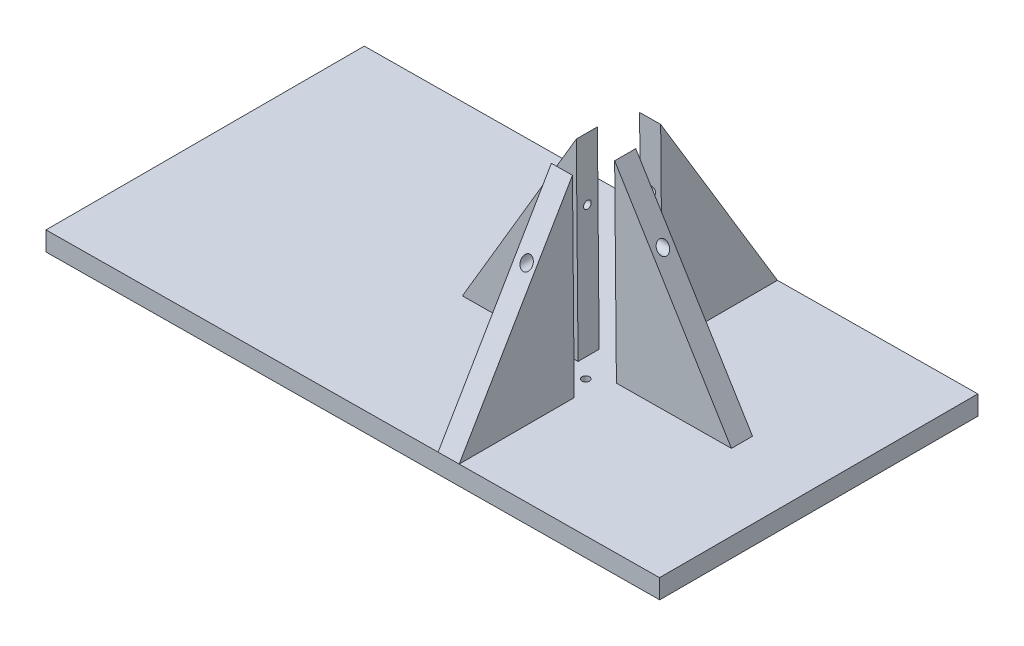
ISO-10303-21;
HEADER;
FILE_DESCRIPTION(('STEP AP214'),'2;1');
FILE_NAME('part.step','',(''),(''),'','','');
FILE_SCHEMA(('AUTOMOTIVE_DESIGN { 1 0 10303 214 1 1 1 1 }'));
ENDSEC;
DATA;
#1=APPLICATION_CONTEXT('core data for automotive mechanical design processes');
#2=APPLICATION_PROTOCOL_DEFINITION('international standard','automotive_design',2000,#1);
#3=PRODUCT_CONTEXT('',#1,'mechanical');
#4=PRODUCT('Part','Part','',(#3));
#5=PRODUCT_RELATED_PRODUCT_CATEGORY('part','',(#4));
#6=PRODUCT_DEFINITION_FORMATION('','',#4);
#7=PRODUCT_DEFINITION_CONTEXT('part definition',#1,'design');
#8=PRODUCT_DEFINITION('design','',#6,#7);
#9=PRODUCT_DEFINITION_SHAPE('','',#8);
#10=(LENGTH_UNIT() NAMED_UNIT(*) SI_UNIT(.MILLI.,.METRE.));
#11=(NAMED_UNIT(*) PLANE_ANGLE_UNIT() SI_UNIT($,.RADIAN.));
#12=(NAMED_UNIT(*) SI_UNIT($,.STERADIAN.) SOLID_ANGLE_UNIT());
#13=UNCERTAINTY_MEASURE_WITH_UNIT(LENGTH_MEASURE(1.E-05),#10,'distance_accuracy_value','');
#14=(GEOMETRIC_REPRESENTATION_CONTEXT(3) GLOBAL_UNCERTAINTY_ASSIGNED_CONTEXT((#13)) GLOBAL_UNIT_ASSIGNED_CONTEXT((#10,
#11,#12)) REPRESENTATION_CONTEXT('',''));
#15=CARTESIAN_POINT('',(0.,0.,0.));
#16=DIRECTION('',(0.,0.,1.));
#17=DIRECTION('',(1.,0.,0.));
#18=AXIS2_PLACEMENT_3D('',#15,#16,#17);
#19=CARTESIAN_POINT('',(2.02302967793391,-221.838378305507,0.));
#20=DIRECTION('',(0.00911900626857644,-0.99995842099793,0.));
#21=DIRECTION('',(0.99995842099793,0.00911900626857644,0.));
#22=AXIS2_PLACEMENT_3D('',#19,#20,#21);
#23=PLANE('',#22);
#24=DIRECTION('',(-0.99995842099793,-0.00911900626857644,0.));
#25=VECTOR('',#24,1.);
#26=CARTESIAN_POINT('',(267.947965627335,-219.41330631554,41.5));
#27=LINE('',#26,#25);
#28=CARTESIAN_POINT('',(370.193714174373,-218.480887924578,41.5));
#29=VERTEX_POINT('',#28);
#30=CARTESIAN_POINT('',(267.947965627335,-219.41330631554,41.5));
#31=VERTEX_POINT('',#30);
#32=EDGE_CURVE('E320',#29,#31,#27,.T.);
#33=ORIENTED_EDGE('',*,*,#32,.F.);
#34=DIRECTION('',(0.,0.,1.));
#35=VECTOR('',#34,1.);
#36=CARTESIAN_POINT('',(370.193714174373,-218.480887924578,11.5));
#37=LINE('',#36,#35);
#38=CARTESIAN_POINT('',(370.193714174389,-218.480887924578,11.5));
#39=VERTEX_POINT('',#38);
#40=EDGE_CURVE('E242',#39,#29,#37,.T.);
#41=ORIENTED_EDGE('',*,*,#40,.F.);
#42=DIRECTION('',(0.99995842099793,0.00911900626857653,0.));
#43=VECTOR('',#42,1.);
#44=CARTESIAN_POINT('',(370.193714174373,-218.480887924578,11.5));
#45=LINE('',#44,#43);
#46=CARTESIAN_POINT('',(375.693485489861,-218.430733390101,11.5));
#47=VERTEX_POINT('',#46);
#48=EDGE_CURVE('E222',#39,#47,#45,.T.);
#49=ORIENTED_EDGE('',*,*,#48,.T.);
#50=DIRECTION('',(0.,0.,1.));
#51=VECTOR('',#50,1.);
#52=CARTESIAN_POINT('',(375.693485489861,-218.430733390101,11.5));
#53=LINE('',#52,#51);
#54=CARTESIAN_POINT('',(375.693485489861,-218.430733390101,41.5));
#55=VERTEX_POINT('',#54);
#56=EDGE_CURVE('E233',#47,#55,#53,.T.);
#57=ORIENTED_EDGE('',*,*,#56,.T.);
#58=CARTESIAN_POINT('',(427.941312987003,-217.954265312568,41.5));
#59=VERTEX_POINT('',#58);
#60=EDGE_CURVE('E305',#59,#55,#27,.T.);
#61=ORIENTED_EDGE('',*,*,#60,.F.);
#62=DIRECTION('',(0.,0.,1.));
#63=VECTOR('',#62,1.);
#64=CARTESIAN_POINT('',(427.941312987003,-217.954265312568,41.5));
#65=LINE('',#64,#63);
#66=CARTESIAN_POINT('',(427.941312987003,-217.954265312568,-41.5));
#67=VERTEX_POINT('',#66);
#68=EDGE_CURVE('E318',#67,#59,#65,.T.);
#69=ORIENTED_EDGE('',*,*,#68,.F.);
#70=DIRECTION('',(0.99995842099793,0.00911900626857644,0.));
#71=VECTOR('',#70,1.);
#72=CARTESIAN_POINT('',(267.947965627335,-219.41330631554,-41.5));
#73=LINE('',#72,#71);
#74=CARTESIAN_POINT('',(375.693485489862,-218.430733390101,-41.5));
#75=VERTEX_POINT('',#74);
#76=EDGE_CURVE('E314',#75,#67,#73,.T.);
#77=ORIENTED_EDGE('',*,*,#76,.F.);
#78=DIRECTION('',(0.,0.,1.));
#79=VECTOR('',#78,1.);
#80=CARTESIAN_POINT('',(375.693485489862,-218.430733390101,0.));
#81=LINE('',#80,#79);
#82=CARTESIAN_POINT('',(375.693485489862,-218.430733390101,-11.5));
#83=VERTEX_POINT('',#82);
#84=EDGE_CURVE('E260',#75,#83,#81,.T.);
#85=ORIENTED_EDGE('',*,*,#84,.T.);
#86=DIRECTION('',(0.99995842099793,0.00911900626857653,0.));
#87=VECTOR('',#86,1.);
#88=CARTESIAN_POINT('',(370.193714174373,-218.480887924578,-11.5));
#89=LINE('',#88,#87);
#90=CARTESIAN_POINT('',(370.193714174373,-218.480887924578,-11.5));
#91=VERTEX_POINT('',#90);
#92=EDGE_CURVE('E265',#91,#83,#89,.T.);
#93=ORIENTED_EDGE('',*,*,#92,.F.);
#94=DIRECTION('',(0.,0.,1.));
#95=VECTOR('',#94,1.);
#96=CARTESIAN_POINT('',(370.193714174373,-218.480887924578,0.));
#97=LINE('',#96,#95);
#98=CARTESIAN_POINT('',(370.193714174373,-218.480887924578,-41.5));
#99=VERTEX_POINT('',#98);
#100=EDGE_CURVE('E250',#99,#91,#97,.T.);
#101=ORIENTED_EDGE('',*,*,#100,.F.);
#102=CARTESIAN_POINT('',(267.947965627335,-219.41330631554,-41.5));
#103=VERTEX_POINT('',#102);
#104=EDGE_CURVE('E315',#103,#99,#73,.T.);
#105=ORIENTED_EDGE('',*,*,#104,.F.);
#106=DIRECTION('',(0.,0.,-1.));
#107=VECTOR('',#106,1.);
#108=CARTESIAN_POINT('',(267.947965627335,-219.41330631554,41.5));
#109=LINE('',#108,#107);
#110=EDGE_CURVE('E298',#31,#103,#109,.T.);
#111=ORIENTED_EDGE('',*,*,#110,.F.);
#112=EDGE_LOOP('',(#33,#41,#49,#57,#61,#69,#77,#85,#93,#101,#105,#111));
#113=FACE_BOUND('',#112,.T.);
#114=CARTESIAN_POINT('',(372.943599832117,-218.45581065734,5.75));
#115=DIRECTION('',(0.00911900626857644,-0.99995842099793,0.));
#116=DIRECTION('',(0.99995842099793,0.00911900626857644,0.));
#117=AXIS2_PLACEMENT_3D('',#114,#115,#116);
#118=CIRCLE('',#117,1.);
#119=CARTESIAN_POINT('',(373.943558253115,-218.446691651071,5.75));
#120=VERTEX_POINT('',#119);
#121=EDGE_CURVE('E290',#120,#120,#118,.F.);
#122=ORIENTED_EDGE('',*,*,#121,.F.);
#123=EDGE_LOOP('',(#122));
#124=FACE_BOUND('',#123,.T.);
#125=CARTESIAN_POINT('',(372.943599832117,-218.45581065734,-5.75));
#126=DIRECTION('',(0.00911900626857644,-0.99995842099793,0.));
#127=DIRECTION('',(0.99995842099793,0.00911900626857644,0.));
#128=AXIS2_PLACEMENT_3D('',#125,#126,#127);
#129=CIRCLE('',#128,1.);
#130=CARTESIAN_POINT('',(373.943558253115,-218.446691651071,-5.75));
#131=VERTEX_POINT('',#130);
#132=EDGE_CURVE('E295',#131,#131,#129,.F.);
#133=ORIENTED_EDGE('',*,*,#132,.F.);
#134=EDGE_LOOP('',(#133));
#135=FACE_BOUND('',#134,.T.);
#136=DIRECTION('',(0.,0.,-1.));
#137=VECTOR('',#136,1.);
#138=CARTESIAN_POINT('',(407.943391937107,-218.136634062691,2.75));
#139=LINE('',#138,#137);
#140=CARTESIAN_POINT('',(407.943391937107,-218.136634062691,2.75));
#141=VERTEX_POINT('',#140);
#142=CARTESIAN_POINT('',(407.943391937107,-218.136634062691,-2.75));
#143=VERTEX_POINT('',#142);
#144=EDGE_CURVE('E291',#141,#143,#139,.T.);
#145=ORIENTED_EDGE('',*,*,#144,.F.);
#146=DIRECTION('',(-0.99995842099793,-0.00911900626857625,0.));
#147=VECTOR('',#146,1.);
#148=CARTESIAN_POINT('',(407.943391937107,-218.136634062691,2.75));
#149=LINE('',#148,#147);
#150=CARTESIAN_POINT('',(377.943391937107,-218.410215625997,2.75));
#151=VERTEX_POINT('',#150);
#152=EDGE_CURVE('E278',#141,#151,#149,.T.);
#153=ORIENTED_EDGE('',*,*,#152,.T.);
#154=DIRECTION('',(0.,0.,-1.));
#155=VECTOR('',#154,1.);
#156=CARTESIAN_POINT('',(377.943391937107,-218.410215625997,2.75));
#157=LINE('',#156,#155);
#158=CARTESIAN_POINT('',(377.943391937107,-218.410215625997,-2.75));
#159=VERTEX_POINT('',#158);
#160=EDGE_CURVE('E288',#151,#159,#157,.T.);
#161=ORIENTED_EDGE('',*,*,#160,.T.);
#162=DIRECTION('',(-0.99995842099793,-0.00911900626857625,0.));
#163=VECTOR('',#162,1.);
#164=CARTESIAN_POINT('',(407.943391937107,-218.136634062691,-2.75));
#165=LINE('',#164,#163);
#166=EDGE_CURVE('E275',#143,#159,#165,.T.);
#167=ORIENTED_EDGE('',*,*,#166,.F.);
#168=EDGE_LOOP('',(#145,#153,#161,#167));
#169=FACE_BOUND('',#168,.T.);
#170=DIRECTION('',(0.,0.,-1.));
#171=VECTOR('',#170,1.);
#172=CARTESIAN_POINT('',(337.943807727127,-218.774987251988,2.75));
#173=LINE('',#172,#171);
#174=CARTESIAN_POINT('',(337.943807727127,-218.774987251988,2.75));
#175=VERTEX_POINT('',#174);
#176=CARTESIAN_POINT('',(337.943807727127,-218.774987251988,-2.75));
#177=VERTEX_POINT('',#176);
#178=EDGE_CURVE('E58',#175,#177,#173,.T.);
#179=ORIENTED_EDGE('',*,*,#178,.T.);
#180=DIRECTION('',(0.99995842099793,0.00911900626857644,0.));
#181=VECTOR('',#180,1.);
#182=CARTESIAN_POINT('',(337.892377656526,-218.775456262625,-2.75));
#183=LINE('',#182,#181);
#184=CARTESIAN_POINT('',(367.943807727127,-218.501405688682,-2.75));
#185=VERTEX_POINT('',#184);
#186=EDGE_CURVE('E172',#177,#185,#183,.T.);
#187=ORIENTED_EDGE('',*,*,#186,.T.);
#188=DIRECTION('',(0.,0.,1.));
#189=VECTOR('',#188,1.);
#190=CARTESIAN_POINT('',(367.943807727127,-218.501405688682,-2.75));
#191=LINE('',#190,#189);
#192=CARTESIAN_POINT('',(367.943807727127,-218.501405688682,2.75));
#193=VERTEX_POINT('',#192);
#194=EDGE_CURVE('E163',#185,#193,#191,.T.);
#195=ORIENTED_EDGE('',*,*,#194,.T.);
#196=DIRECTION('',(-0.99995842099793,-0.00911900626857644,0.));
#197=VECTOR('',#196,1.);
#198=CARTESIAN_POINT('',(367.889882968266,-218.501897449344,2.75));
#199=LINE('',#198,#197);
#200=EDGE_CURVE('E63',#193,#175,#199,.T.);
#201=ORIENTED_EDGE('',*,*,#200,.T.);
#202=EDGE_LOOP('',(#179,#187,#195,#201));
#203=FACE_BOUND('',#202,.T.);
#204=ADVANCED_FACE('F41',(#113,#124,#135,#169,#203),#23,.F.);
#205=CARTESIAN_POINT('',(370.50144452687,49.3424220603207,5.75));
#206=DIRECTION('',(0.00911900626857644,-0.99995842099793,0.));
#207=DIRECTION('',(0.99995842099793,0.00911900626857644,0.));
#208=AXIS2_PLACEMENT_3D('',#205,#206,#207);
#209=CYLINDRICAL_SURFACE('',#208,1.);
#210=ORIENTED_EDGE('',*,*,#121,.T.);
#211=EDGE_LOOP('',(#210));
#212=FACE_BOUND('',#211,.T.);
#213=CARTESIAN_POINT('',(372.966397347788,-220.955706709834,5.75));
#214=DIRECTION('',(0.00911900626857644,-0.99995842099793,0.));
#215=DIRECTION('',(0.99995842099793,0.00911900626857644,0.));
#216=AXIS2_PLACEMENT_3D('',#213,#214,#215);
#217=CIRCLE('',#216,1.);
#218=CARTESIAN_POINT('',(373.966355768786,-220.946587703566,5.75));
#219=VERTEX_POINT('',#218);
#220=EDGE_CURVE('E45',#219,#219,#217,.F.);
#221=ORIENTED_EDGE('',*,*,#220,.F.);
#222=EDGE_LOOP('',(#221));
#223=FACE_BOUND('',#222,.T.);
#224=ADVANCED_FACE('F349',(#212,#223),#209,.F.);
#225=CARTESIAN_POINT('',(370.50144452687,49.3424220603207,-5.75));
#226=DIRECTION('',(0.00911900626857644,-0.99995842099793,0.));
#227=DIRECTION('',(0.99995842099793,0.00911900626857644,0.));
#228=AXIS2_PLACEMENT_3D('',#225,#226,#227);
#229=CYLINDRICAL_SURFACE('',#228,1.);
#230=ORIENTED_EDGE('',*,*,#132,.T.);
#231=EDGE_LOOP('',(#230));
#232=FACE_BOUND('',#231,.T.);
#233=CARTESIAN_POINT('',(372.966397347788,-220.955706709834,-5.75));
#234=DIRECTION('',(0.00911900626857644,-0.99995842099793,0.));
#235=DIRECTION('',(0.99995842099793,0.00911900626857644,0.));
#236=AXIS2_PLACEMENT_3D('',#233,#234,#235);
#237=CIRCLE('',#236,1.);
#238=CARTESIAN_POINT('',(373.966355768786,-220.946587703566,-5.75));
#239=VERTEX_POINT('',#238);
#240=EDGE_CURVE('E193',#239,#239,#237,.F.);
#241=ORIENTED_EDGE('',*,*,#240,.F.);
#242=EDGE_LOOP('',(#241));
#243=FACE_BOUND('',#242,.T.);
#244=ADVANCED_FACE('F351',(#232,#243),#229,.F.);
#245=CARTESIAN_POINT('',(372.943599832117,-184.544957101533,-108.805145236167));
#246=DIRECTION('',(0.,0.,1.));
#247=DIRECTION('',(1.,0.,0.));
#248=AXIS2_PLACEMENT_3D('',#245,#246,#247);
#249=CYLINDRICAL_SURFACE('',#248,0.999999999999998);
#250=CARTESIAN_POINT('',(372.943599832117,-184.544957101533,11.5));
#251=DIRECTION('',(0.,0.,1.));
#252=DIRECTION('',(1.,0.,0.));
#253=AXIS2_PLACEMENT_3D('',#250,#251,#252);
#254=CIRCLE('',#253,0.999999999999998);
#255=CARTESIAN_POINT('',(373.943599832117,-184.544957101533,11.5));
#256=VERTEX_POINT('',#255);
#257=EDGE_CURVE('E215',#256,#256,#254,.T.);
#258=ORIENTED_EDGE('',*,*,#257,.F.);
#259=EDGE_LOOP('',(#258));
#260=FACE_BOUND('',#259,.T.);
#261=CARTESIAN_POINT('',(372.943599832117,-184.544957101533,13.5));
#262=DIRECTION('',(0.,0.,1.));
#263=DIRECTION('',(1.,0.,0.));
#264=AXIS2_PLACEMENT_3D('',#261,#262,#263);
#265=CIRCLE('',#264,0.999999999999998);
#266=CARTESIAN_POINT('',(373.943599832117,-184.544957101533,13.5));
#267=VERTEX_POINT('',#266);
#268=EDGE_CURVE('E205',#267,#267,#265,.F.);
#269=ORIENTED_EDGE('',*,*,#268,.F.);
#270=EDGE_LOOP('',(#269));
#271=FACE_BOUND('',#270,.T.);
#272=ADVANCED_FACE('F359',(#260,#271),#249,.F.);
#273=CARTESIAN_POINT('',(-0.332235837698924,-187.991782012144,0.));
#274=DIRECTION('',(0.99995842099793,0.00911900626857653,0.));
#275=DIRECTION('',(-0.00911900626857653,0.99995842099793,0.));
#276=AXIS2_PLACEMENT_3D('',#273,#274,#275);
#277=CYLINDRICAL_SURFACE('',#276,1.);
#278=CARTESIAN_POINT('',(377.634561591478,-184.544957101533,0.));
#279=DIRECTION('',(-0.99995842099793,-0.00911900626857608,0.));
#280=DIRECTION('',(0.00911900626857607,-0.99995842099793,0.));
#281=AXIS2_PLACEMENT_3D('',#278,#279,#280);
#282=CIRCLE('',#281,1.);
#283=CARTESIAN_POINT('',(377.643680597746,-185.544915522531,0.));
#284=VERTEX_POINT('',#283);
#285=EDGE_CURVE('E212',#284,#284,#282,.T.);
#286=ORIENTED_EDGE('',*,*,#285,.T.);
#287=EDGE_LOOP('',(#286));
#288=FACE_BOUND('',#287,.T.);
#289=CARTESIAN_POINT('',(379.634478433474,-184.526719088996,0.));
#290=DIRECTION('',(0.99995842099793,0.00911900626857653,0.));
#291=DIRECTION('',(-0.00911900626857653,0.99995842099793,0.));
#292=AXIS2_PLACEMENT_3D('',#289,#290,#291);
#293=CIRCLE('',#292,1.);
#294=CARTESIAN_POINT('',(379.625359427205,-183.526760667998,0.));
#295=VERTEX_POINT('',#294);
#296=EDGE_CURVE('E210',#295,#295,#293,.F.);
#297=ORIENTED_EDGE('',*,*,#296,.F.);
#298=EDGE_LOOP('',(#297));
#299=FACE_BOUND('',#298,.T.);
#300=ADVANCED_FACE('F385',(#288,#299),#277,.F.);
#301=CARTESIAN_POINT('',(267.993560658677,-224.41309842053,41.5));
#302=DIRECTION('',(0.99995842099793,0.00911900626857646,0.));
#303=DIRECTION('',(-0.00911900626857646,0.99995842099793,0.));
#304=AXIS2_PLACEMENT_3D('',#301,#302,#303);
#305=PLANE('',#304);
#306=ORIENTED_EDGE('',*,*,#110,.T.);
#307=DIRECTION('',(-0.00911900626857646,0.99995842099793,0.));
#308=VECTOR('',#307,1.);
#309=CARTESIAN_POINT('',(267.993560658677,-224.41309842053,-41.5));
#310=LINE('',#309,#308);
#311=CARTESIAN_POINT('',(267.993560658677,-224.41309842053,-41.5));
#312=VERTEX_POINT('',#311);
#313=EDGE_CURVE('E12',#312,#103,#310,.T.);
#314=ORIENTED_EDGE('',*,*,#313,.F.);
#315=DIRECTION('',(0.,0.,-1.));
#316=VECTOR('',#315,1.);
#317=CARTESIAN_POINT('',(267.993560658677,-224.41309842053,41.5));
#318=LINE('',#317,#316);
#319=CARTESIAN_POINT('',(267.993560658677,-224.41309842053,41.5));
#320=VERTEX_POINT('',#319);
#321=EDGE_CURVE('E301',#320,#312,#318,.T.);
#322=ORIENTED_EDGE('',*,*,#321,.F.);
#323=DIRECTION('',(-0.00911900626857646,0.99995842099793,0.));
#324=VECTOR('',#323,1.);
#325=CARTESIAN_POINT('',(267.993560658677,-224.41309842053,41.5));
#326=LINE('',#325,#324);
#327=EDGE_CURVE('E311',#320,#31,#326,.T.);
#328=ORIENTED_EDGE('',*,*,#327,.T.);
#329=EDGE_LOOP('',(#306,#314,#322,#328));
#330=FACE_BOUND('',#329,.T.);
#331=ADVANCED_FACE('F43',(#330),#305,.F.);
#332=CARTESIAN_POINT('',(267.993560658677,-224.41309842053,-41.5));
#333=DIRECTION('',(0.,0.,1.));
#334=DIRECTION('',(1.,0.,0.));
#335=AXIS2_PLACEMENT_3D('',#332,#333,#334);
#336=PLANE('',#335);
#337=ORIENTED_EDGE('',*,*,#104,.T.);
#338=DIRECTION('',(0.99995842099793,0.00911900626857653,0.));
#339=VECTOR('',#338,1.);
#340=CARTESIAN_POINT('',(370.193714174373,-218.480887924578,-41.5));
#341=LINE('',#340,#339);
#342=EDGE_CURVE('E268',#99,#75,#341,.T.);
#343=ORIENTED_EDGE('',*,*,#342,.T.);
#344=ORIENTED_EDGE('',*,*,#76,.T.);
#345=DIRECTION('',(-0.00911900626857646,0.99995842099793,0.));
#346=VECTOR('',#345,1.);
#347=CARTESIAN_POINT('',(427.986908018346,-222.954057417558,-41.5));
#348=LINE('',#347,#346);
#349=CARTESIAN_POINT('',(427.986908018346,-222.954057417558,-41.5));
#350=VERTEX_POINT('',#349);
#351=EDGE_CURVE('E50',#350,#67,#348,.T.);
#352=ORIENTED_EDGE('',*,*,#351,.F.);
#353=DIRECTION('',(0.99995842099793,0.00911900626857644,0.));
#354=VECTOR('',#353,1.);
#355=CARTESIAN_POINT('',(267.993560658677,-224.41309842053,-41.5));
#356=LINE('',#355,#354);
#357=EDGE_CURVE('E304',#312,#350,#356,.T.);
#358=ORIENTED_EDGE('',*,*,#357,.F.);
#359=ORIENTED_EDGE('',*,*,#313,.T.);
#360=EDGE_LOOP('',(#337,#343,#344,#352,#358,#359));
#361=FACE_BOUND('',#360,.T.);
#362=ADVANCED_FACE('F377',(#361),#336,.F.);
#363=CARTESIAN_POINT('',(427.986908018346,-222.954057417558,41.5));
#364=DIRECTION('',(-0.99995842099793,-0.00911900626857646,0.));
#365=DIRECTION('',(0.00911900626857646,-0.99995842099793,0.));
#366=AXIS2_PLACEMENT_3D('',#363,#364,#365);
#367=PLANE('',#366);
#368=ORIENTED_EDGE('',*,*,#68,.T.);
#369=DIRECTION('',(-0.00911900626857646,0.99995842099793,0.));
#370=VECTOR('',#369,1.);
#371=CARTESIAN_POINT('',(427.986908018346,-222.954057417558,41.5));
#372=LINE('',#371,#370);
#373=CARTESIAN_POINT('',(427.986908018346,-222.954057417558,41.5));
#374=VERTEX_POINT('',#373);
#375=EDGE_CURVE('E325',#374,#59,#372,.T.);
#376=ORIENTED_EDGE('',*,*,#375,.F.);
#377=DIRECTION('',(0.,0.,1.));
#378=VECTOR('',#377,1.);
#379=CARTESIAN_POINT('',(427.986908018346,-222.954057417558,41.5));
#380=LINE('',#379,#378);
#381=EDGE_CURVE('E307',#350,#374,#380,.T.);
#382=ORIENTED_EDGE('',*,*,#381,.F.);
#383=ORIENTED_EDGE('',*,*,#351,.T.);
#384=EDGE_LOOP('',(#368,#376,#382,#383));
#385=FACE_BOUND('',#384,.T.);
#386=ADVANCED_FACE('F374',(#385),#367,.F.);
#387=CARTESIAN_POINT('',(267.993560658677,-224.41309842053,41.5));
#388=DIRECTION('',(0.,0.,-1.));
#389=DIRECTION('',(-1.,0.,0.));
#390=AXIS2_PLACEMENT_3D('',#387,#388,#389);
#391=PLANE('',#390);
#392=ORIENTED_EDGE('',*,*,#60,.T.);
#393=DIRECTION('',(0.99995842099793,0.00911900626857653,0.));
#394=VECTOR('',#393,1.);
#395=CARTESIAN_POINT('',(370.193714174373,-218.480887924578,41.5));
#396=LINE('',#395,#394);
#397=EDGE_CURVE('E224',#29,#55,#396,.T.);
#398=ORIENTED_EDGE('',*,*,#397,.F.);
#399=ORIENTED_EDGE('',*,*,#32,.T.);
#400=ORIENTED_EDGE('',*,*,#327,.F.);
#401=DIRECTION('',(-0.99995842099793,-0.00911900626857644,0.));
#402=VECTOR('',#401,1.);
#403=CARTESIAN_POINT('',(267.993560658677,-224.41309842053,41.5));
#404=LINE('',#403,#402);
#405=EDGE_CURVE('E309',#374,#320,#404,.T.);
#406=ORIENTED_EDGE('',*,*,#405,.F.);
#407=ORIENTED_EDGE('',*,*,#375,.T.);
#408=EDGE_LOOP('',(#392,#398,#399,#400,#406,#407));
#409=FACE_BOUND('',#408,.T.);
#410=ADVANCED_FACE('F369',(#409),#391,.F.);
#411=CARTESIAN_POINT('',(2.0686247092768,-226.838170410497,0.));
#412=DIRECTION('',(0.00911900626857644,-0.99995842099793,0.));
#413=DIRECTION('',(0.99995842099793,0.00911900626857644,0.));
#414=AXIS2_PLACEMENT_3D('',#411,#412,#413);
#415=PLANE('',#414);
#416=CARTESIAN_POINT('',(372.98919486346,-223.455602762329,-5.75));
#417=DIRECTION('',(0.00911900626857644,-0.99995842099793,0.));
#418=DIRECTION('',(0.99995842099793,0.00911900626857644,0.));
#419=AXIS2_PLACEMENT_3D('',#416,#417,#418);
#420=CIRCLE('',#419,1.99999999999995);
#421=CARTESIAN_POINT('',(374.989111705456,-223.437364749792,-5.75));
#422=VERTEX_POINT('',#421);
#423=EDGE_CURVE('E186',#422,#422,#420,.T.);
#424=ORIENTED_EDGE('',*,*,#423,.F.);
#425=EDGE_LOOP('',(#424));
#426=FACE_BOUND('',#425,.T.);
#427=CARTESIAN_POINT('',(372.98919486346,-223.455602762329,5.75));
#428=DIRECTION('',(0.00911900626857644,-0.99995842099793,0.));
#429=DIRECTION('',(0.99995842099793,0.00911900626857644,0.));
#430=AXIS2_PLACEMENT_3D('',#427,#428,#429);
#431=CIRCLE('',#430,2.);
#432=CARTESIAN_POINT('',(374.989111705456,-223.437364749792,5.75));
#433=VERTEX_POINT('',#432);
#434=EDGE_CURVE('E190',#433,#433,#431,.T.);
#435=ORIENTED_EDGE('',*,*,#434,.F.);
#436=EDGE_LOOP('',(#435));
#437=FACE_BOUND('',#436,.T.);
#438=ORIENTED_EDGE('',*,*,#321,.T.);
#439=ORIENTED_EDGE('',*,*,#357,.T.);
#440=ORIENTED_EDGE('',*,*,#381,.T.);
#441=ORIENTED_EDGE('',*,*,#405,.T.);
#442=EDGE_LOOP('',(#438,#439,#440,#441));
#443=FACE_BOUND('',#442,.T.);
#444=ADVANCED_FACE('F366',(#426,#437,#443),#415,.T.);
#445=CARTESIAN_POINT('',(377.943391937107,-218.410215625997,2.75));
#446=DIRECTION('',(-0.99995842099793,-0.00911900626857608,0.));
#447=DIRECTION('',(0.00911900626857607,-0.99995842099793,0.));
#448=AXIS2_PLACEMENT_3D('',#445,#446,#447);
#449=PLANE('',#448);
#450=ORIENTED_EDGE('',*,*,#285,.F.);
#451=EDGE_LOOP('',(#450));
#452=FACE_BOUND('',#451,.T.);
#453=DIRECTION('',(-0.00911900626857608,0.99995842099793,0.));
#454=VECTOR('',#453,1.);
#455=CARTESIAN_POINT('',(377.943391937107,-218.410215625997,-2.75));
#456=LINE('',#455,#454);
#457=CARTESIAN_POINT('',(377.487422664931,-168.410215625997,-2.75));
#458=VERTEX_POINT('',#457);
#459=EDGE_CURVE('E270',#159,#458,#456,.T.);
#460=ORIENTED_EDGE('',*,*,#459,.F.);
#461=ORIENTED_EDGE('',*,*,#160,.F.);
#462=DIRECTION('',(-0.00911900626857608,0.99995842099793,0.));
#463=VECTOR('',#462,1.);
#464=CARTESIAN_POINT('',(377.943391937107,-218.410215625997,2.75));
#465=LINE('',#464,#463);
#466=CARTESIAN_POINT('',(377.487422664931,-168.410215625997,2.75));
#467=VERTEX_POINT('',#466);
#468=EDGE_CURVE('E271',#151,#467,#465,.T.);
#469=ORIENTED_EDGE('',*,*,#468,.T.);
#470=DIRECTION('',(0.,0.,-1.));
#471=VECTOR('',#470,1.);
#472=CARTESIAN_POINT('',(377.487422664931,-168.410215625997,2.75));
#473=LINE('',#472,#471);
#474=EDGE_CURVE('E280',#467,#458,#473,.T.);
#475=ORIENTED_EDGE('',*,*,#474,.T.);
#476=EDGE_LOOP('',(#460,#461,#469,#475));
#477=FACE_BOUND('',#476,.T.);
#478=ADVANCED_FACE('F368',(#452,#477),#449,.T.);
#479=CARTESIAN_POINT('',(377.487422664931,-168.410215625997,2.75));
#480=DIRECTION('',(0.852765581993512,0.522293846572279,0.));
#481=DIRECTION('',(-0.522293846572279,0.852765581993512,0.));
#482=AXIS2_PLACEMENT_3D('',#479,#480,#481);
#483=PLANE('',#482);
#484=CARTESIAN_POINT('',(387.3154064768,-184.456673745605,0.));
#485=DIRECTION('',(0.852765581993512,0.522293846572279,0.));
#486=DIRECTION('',(-0.522293846572279,0.852765581993512,0.));
#487=AXIS2_PLACEMENT_3D('',#484,#485,#486);
#488=ELLIPSE('',#487,1.74928556845359,1.5);
#489=CARTESIAN_POINT('',(386.401765388499,-182.96494321975,0.));
#490=VERTEX_POINT('',#489);
#491=EDGE_CURVE('E216',#490,#490,#488,.F.);
#492=ORIENTED_EDGE('',*,*,#491,.T.);
#493=EDGE_LOOP('',(#492));
#494=FACE_BOUND('',#493,.T.);
#495=DIRECTION('',(0.522293846572279,-0.852765581993512,0.));
#496=VECTOR('',#495,1.);
#497=CARTESIAN_POINT('',(377.487422664931,-168.410215625997,-2.75));
#498=LINE('',#497,#496);
#499=EDGE_CURVE('E283',#458,#143,#498,.T.);
#500=ORIENTED_EDGE('',*,*,#499,.F.);
#501=ORIENTED_EDGE('',*,*,#474,.F.);
#502=DIRECTION('',(0.522293846572279,-0.852765581993512,0.));
#503=VECTOR('',#502,1.);
#504=CARTESIAN_POINT('',(377.487422664931,-168.410215625997,2.75));
#505=LINE('',#504,#503);
#506=EDGE_CURVE('E274',#467,#141,#505,.T.);
#507=ORIENTED_EDGE('',*,*,#506,.T.);
#508=ORIENTED_EDGE('',*,*,#144,.T.);
#509=EDGE_LOOP('',(#500,#501,#507,#508));
#510=FACE_BOUND('',#509,.T.);
#511=ADVANCED_FACE('F458',(#494,#510),#483,.T.);
#512=CARTESIAN_POINT('',(0.,0.,2.75));
#513=DIRECTION('',(0.,0.,1.));
#514=DIRECTION('',(1.,0.,0.));
#515=AXIS2_PLACEMENT_3D('',#512,#513,#514);
#516=PLANE('',#515);
#517=ORIENTED_EDGE('',*,*,#468,.F.);
#518=ORIENTED_EDGE('',*,*,#152,.F.);
#519=ORIENTED_EDGE('',*,*,#506,.F.);
#520=EDGE_LOOP('',(#517,#518,#519));
#521=FACE_BOUND('',#520,.T.);
#522=ADVANCED_FACE('F455',(#521),#516,.T.);
#523=CARTESIAN_POINT('',(0.,0.,-2.75));
#524=DIRECTION('',(0.,0.,1.));
#525=DIRECTION('',(1.,0.,0.));
#526=AXIS2_PLACEMENT_3D('',#523,#524,#525);
#527=PLANE('',#526);
#528=ORIENTED_EDGE('',*,*,#459,.T.);
#529=ORIENTED_EDGE('',*,*,#499,.T.);
#530=ORIENTED_EDGE('',*,*,#166,.T.);
#531=EDGE_LOOP('',(#528,#529,#530));
#532=FACE_BOUND('',#531,.T.);
#533=ADVANCED_FACE('F453',(#532),#527,.F.);
#534=CARTESIAN_POINT('',(368.539234075828,-37.0563710213758,67.3592364003371));
#535=DIRECTION('',(-0.00469169001889963,0.514474363207447,-0.857492925712544));
#536=DIRECTION('',(0.,0.857502363416298,0.514480025594253));
#537=AXIS2_PLACEMENT_3D('',#534,#535,#536);
#538=PLANE('',#537);
#539=CARTESIAN_POINT('',(372.943599832117,-184.544957101533,-21.1543338541864));
#540=DIRECTION('',(-0.00469169001889963,0.514474363207447,-0.857492925712544));
#541=DIRECTION('',(-0.00781948336483272,0.857457272012411,0.514495755427527));
#542=AXIS2_PLACEMENT_3D('',#539,#540,#541);
#543=ELLIPSE('',#542,1.74928556845362,1.50000000000002);
#544=CARTESIAN_POINT('',(372.929921322714,-183.045019470036,-20.2543338541864));
#545=VERTEX_POINT('',#544);
#546=EDGE_CURVE('E206',#545,#545,#543,.T.);
#547=ORIENTED_EDGE('',*,*,#546,.F.);
#548=EDGE_LOOP('',(#547));
#549=FACE_BOUND('',#548,.T.);
#550=DIRECTION('',(-0.00781948336483279,0.857457272012411,0.514495755427527));
#551=VECTOR('',#550,1.);
#552=CARTESIAN_POINT('',(374.039005391316,-37.0062164868986,67.3592364003371));
#553=LINE('',#552,#551);
#554=CARTESIAN_POINT('',(375.237535176433,-168.432812340204,-11.5));
#555=VERTEX_POINT('',#554);
#556=EDGE_CURVE('E239',#75,#555,#553,.T.);
#557=ORIENTED_EDGE('',*,*,#556,.F.);
#558=ORIENTED_EDGE('',*,*,#342,.F.);
#559=DIRECTION('',(-0.00781948336483279,0.857457272012411,0.514495755427527));
#560=VECTOR('',#559,1.);
#561=CARTESIAN_POINT('',(368.539234075828,-37.0563710213758,67.3592364003371));
#562=LINE('',#561,#560);
#563=CARTESIAN_POINT('',(369.737763860944,-168.482966874682,-11.5));
#564=VERTEX_POINT('',#563);
#565=EDGE_CURVE('E247',#99,#564,#562,.T.);
#566=ORIENTED_EDGE('',*,*,#565,.T.);
#567=DIRECTION('',(0.99995842099793,0.00911900626857653,0.));
#568=VECTOR('',#567,1.);
#569=CARTESIAN_POINT('',(369.737763860944,-168.482966874682,-11.5));
#570=LINE('',#569,#568);
#571=EDGE_CURVE('E257',#564,#555,#570,.T.);
#572=ORIENTED_EDGE('',*,*,#571,.T.);
#573=EDGE_LOOP('',(#557,#558,#566,#572));
#574=FACE_BOUND('',#573,.T.);
#575=ADVANCED_FACE('F394',(#549,#574),#538,.T.);
#576=CARTESIAN_POINT('',(368.170684496439,3.35749038092869,-11.5));
#577=DIRECTION('',(0.,0.,1.));
#578=DIRECTION('',(1.,0.,0.));
#579=AXIS2_PLACEMENT_3D('',#576,#577,#578);
#580=PLANE('',#579);
#581=CARTESIAN_POINT('',(372.943599832117,-184.544957101533,-11.5));
#582=DIRECTION('',(0.,0.,1.));
#583=DIRECTION('',(1.,0.,0.));
#584=AXIS2_PLACEMENT_3D('',#581,#582,#583);
#585=CIRCLE('',#584,0.999999999999998);
#586=CARTESIAN_POINT('',(373.943599832117,-184.544957101533,-11.5));
#587=VERTEX_POINT('',#586);
#588=EDGE_CURVE('E219',#587,#587,#585,.T.);
#589=ORIENTED_EDGE('',*,*,#588,.F.);
#590=EDGE_LOOP('',(#589));
#591=FACE_BOUND('',#590,.T.);
#592=DIRECTION('',(0.00911900626857668,-0.99995842099793,0.));
#593=VECTOR('',#592,1.);
#594=CARTESIAN_POINT('',(373.670455811928,3.40764491540586,-11.5));
#595=LINE('',#594,#593);
#596=EDGE_CURVE('E251',#555,#83,#595,.T.);
#597=ORIENTED_EDGE('',*,*,#596,.F.);
#598=ORIENTED_EDGE('',*,*,#571,.F.);
#599=DIRECTION('',(0.00911900626857668,-0.99995842099793,0.));
#600=VECTOR('',#599,1.);
#601=CARTESIAN_POINT('',(368.170684496439,3.35749038092869,-11.5));
#602=LINE('',#601,#600);
#603=EDGE_CURVE('E254',#564,#91,#602,.T.);
#604=ORIENTED_EDGE('',*,*,#603,.T.);
#605=ORIENTED_EDGE('',*,*,#92,.T.);
#606=EDGE_LOOP('',(#597,#598,#604,#605));
#607=FACE_BOUND('',#606,.T.);
#608=ADVANCED_FACE('F400',(#591,#607),#580,.T.);
#609=CARTESIAN_POINT('',(368.170684496439,3.35749038092869,0.));
#610=DIRECTION('',(-0.99995842099793,-0.00911900626857668,0.));
#611=DIRECTION('',(0.00911900626857668,-0.99995842099793,0.));
#612=AXIS2_PLACEMENT_3D('',#609,#610,#611);
#613=PLANE('',#612);
#614=ORIENTED_EDGE('',*,*,#565,.F.);
#615=ORIENTED_EDGE('',*,*,#100,.T.);
#616=ORIENTED_EDGE('',*,*,#603,.F.);
#617=EDGE_LOOP('',(#614,#615,#616));
#618=FACE_BOUND('',#617,.T.);
#619=ADVANCED_FACE('F397',(#618),#613,.T.);
#620=CARTESIAN_POINT('',(373.670455811928,3.40764491540586,0.));
#621=DIRECTION('',(-0.99995842099793,-0.00911900626857668,0.));
#622=DIRECTION('',(0.00911900626857668,-0.99995842099793,0.));
#623=AXIS2_PLACEMENT_3D('',#620,#621,#622);
#624=PLANE('',#623);
#625=ORIENTED_EDGE('',*,*,#556,.T.);
#626=ORIENTED_EDGE('',*,*,#596,.T.);
#627=ORIENTED_EDGE('',*,*,#84,.F.);
#628=EDGE_LOOP('',(#625,#626,#627));
#629=FACE_BOUND('',#628,.T.);
#630=ADVANCED_FACE('F403',(#629),#624,.F.);
#631=CARTESIAN_POINT('',(369.737763860944,-168.482966874682,11.5));
#632=DIRECTION('',(0.,0.,1.));
#633=DIRECTION('',(1.,0.,0.));
#634=AXIS2_PLACEMENT_3D('',#631,#632,#633);
#635=PLANE('',#634);
#636=ORIENTED_EDGE('',*,*,#257,.T.);
#637=EDGE_LOOP('',(#636));
#638=FACE_BOUND('',#637,.T.);
#639=DIRECTION('',(0.00911900626857643,-0.99995842099793,0.));
#640=VECTOR('',#639,1.);
#641=CARTESIAN_POINT('',(375.237535176433,-168.432812340204,11.5));
#642=LINE('',#641,#640);
#643=CARTESIAN_POINT('',(375.237535176433,-168.432812340204,11.5));
#644=VERTEX_POINT('',#643);
#645=EDGE_CURVE('E236',#644,#47,#642,.T.);
#646=ORIENTED_EDGE('',*,*,#645,.T.);
#647=ORIENTED_EDGE('',*,*,#48,.F.);
#648=DIRECTION('',(0.00911900626857643,-0.99995842099793,0.));
#649=VECTOR('',#648,1.);
#650=CARTESIAN_POINT('',(369.737763860944,-168.482966874682,11.5));
#651=LINE('',#650,#649);
#652=CARTESIAN_POINT('',(369.737763860944,-168.482966874682,11.5));
#653=VERTEX_POINT('',#652);
#654=EDGE_CURVE('E234',#653,#39,#651,.T.);
#655=ORIENTED_EDGE('',*,*,#654,.F.);
#656=DIRECTION('',(0.99995842099793,0.00911900626857653,0.));
#657=VECTOR('',#656,1.);
#658=CARTESIAN_POINT('',(369.737763860944,-168.482966874682,11.5));
#659=LINE('',#658,#657);
#660=EDGE_CURVE('E227',#653,#644,#659,.T.);
#661=ORIENTED_EDGE('',*,*,#660,.T.);
#662=EDGE_LOOP('',(#646,#647,#655,#661));
#663=FACE_BOUND('',#662,.T.);
#664=ADVANCED_FACE('F425',(#638,#663),#635,.F.);
#665=CARTESIAN_POINT('',(369.737763860944,-168.482966874682,11.5));
#666=DIRECTION('',(-0.00469169001889963,0.514474363207447,0.857492925712544));
#667=DIRECTION('',(0.,-0.857502363416298,0.514480025594253));
#668=AXIS2_PLACEMENT_3D('',#665,#666,#667);
#669=PLANE('',#668);
#670=CARTESIAN_POINT('',(372.943599832117,-184.544957101533,21.1543338541864));
#671=DIRECTION('',(-0.00469169001889963,0.514474363207447,0.857492925712544));
#672=DIRECTION('',(-0.00781948336483272,0.857457272012411,-0.514495755427527));
#673=AXIS2_PLACEMENT_3D('',#670,#671,#672);
#674=ELLIPSE('',#673,1.74928556845362,1.50000000000002);
#675=CARTESIAN_POINT('',(372.929921322714,-183.045019470036,20.2543338541864));
#676=VERTEX_POINT('',#675);
#677=EDGE_CURVE('E211',#676,#676,#674,.F.);
#678=ORIENTED_EDGE('',*,*,#677,.T.);
#679=EDGE_LOOP('',(#678));
#680=FACE_BOUND('',#679,.T.);
#681=DIRECTION('',(0.00781948336483263,-0.857457272012411,0.514495755427527));
#682=VECTOR('',#681,1.);
#683=CARTESIAN_POINT('',(375.237535176433,-168.432812340204,11.5));
#684=LINE('',#683,#682);
#685=EDGE_CURVE('E230',#644,#55,#684,.T.);
#686=ORIENTED_EDGE('',*,*,#685,.F.);
#687=ORIENTED_EDGE('',*,*,#660,.F.);
#688=DIRECTION('',(0.00781948336483263,-0.857457272012411,0.514495755427527));
#689=VECTOR('',#688,1.);
#690=CARTESIAN_POINT('',(369.737763860944,-168.482966874682,11.5));
#691=LINE('',#690,#689);
#692=EDGE_CURVE('E229',#653,#29,#691,.T.);
#693=ORIENTED_EDGE('',*,*,#692,.T.);
#694=ORIENTED_EDGE('',*,*,#397,.T.);
#695=EDGE_LOOP('',(#686,#687,#693,#694));
#696=FACE_BOUND('',#695,.T.);
#697=ADVANCED_FACE('F422',(#680,#696),#669,.T.);
#698=CARTESIAN_POINT('',(368.170684496439,3.3574903809286,0.));
#699=DIRECTION('',(-0.99995842099793,-0.00911900626857643,0.));
#700=DIRECTION('',(0.00911900626857643,-0.99995842099793,0.));
#701=AXIS2_PLACEMENT_3D('',#698,#699,#700);
#702=PLANE('',#701);
#703=ORIENTED_EDGE('',*,*,#654,.T.);
#704=ORIENTED_EDGE('',*,*,#40,.T.);
#705=ORIENTED_EDGE('',*,*,#692,.F.);
#706=EDGE_LOOP('',(#703,#704,#705));
#707=FACE_BOUND('',#706,.T.);
#708=ADVANCED_FACE('F419',(#707),#702,.T.);
#709=CARTESIAN_POINT('',(373.670455811928,3.40764491540577,0.));
#710=DIRECTION('',(-0.99995842099793,-0.00911900626857643,0.));
#711=DIRECTION('',(0.00911900626857643,-0.99995842099793,0.));
#712=AXIS2_PLACEMENT_3D('',#709,#710,#711);
#713=PLANE('',#712);
#714=ORIENTED_EDGE('',*,*,#645,.F.);
#715=ORIENTED_EDGE('',*,*,#685,.T.);
#716=ORIENTED_EDGE('',*,*,#56,.F.);
#717=EDGE_LOOP('',(#714,#715,#716));
#718=FACE_BOUND('',#717,.T.);
#719=ADVANCED_FACE('F428',(#718),#713,.F.);
#720=CARTESIAN_POINT('',(372.943599832117,-184.544957101533,-13.5));
#721=DIRECTION('',(0.,0.,1.));
#722=DIRECTION('',(1.,0.,0.));
#723=AXIS2_PLACEMENT_3D('',#720,#721,#722);
#724=CIRCLE('',#723,0.999999999999998);
#725=CARTESIAN_POINT('',(373.943599832117,-184.544957101533,-13.5));
#726=VERTEX_POINT('',#725);
#727=EDGE_CURVE('E201',#726,#726,#724,.F.);
#728=ORIENTED_EDGE('',*,*,#727,.T.);
#729=EDGE_LOOP('',(#728));
#730=FACE_BOUND('',#729,.T.);
#731=ORIENTED_EDGE('',*,*,#588,.T.);
#732=EDGE_LOOP('',(#731));
#733=FACE_BOUND('',#732,.T.);
#734=ADVANCED_FACE('F430',(#730,#733),#249,.F.);
#735=CARTESIAN_POINT('',(379.634478433474,-184.526719088996,0.));
#736=DIRECTION('',(0.99995842099793,0.00911900626857653,0.));
#737=DIRECTION('',(-0.00911900626857653,0.99995842099793,0.));
#738=AXIS2_PLACEMENT_3D('',#735,#736,#737);
#739=PLANE('',#738);
#740=CARTESIAN_POINT('',(379.634478433474,-184.526719088996,0.));
#741=DIRECTION('',(0.99995842099793,0.00911900626857653,0.));
#742=DIRECTION('',(-0.00911900626857653,0.99995842099793,0.));
#743=AXIS2_PLACEMENT_3D('',#740,#741,#742);
#744=CIRCLE('',#743,1.5);
#745=CARTESIAN_POINT('',(379.620799924071,-183.026781457499,0.));
#746=VERTEX_POINT('',#745);
#747=EDGE_CURVE('E207',#746,#746,#744,.T.);
#748=ORIENTED_EDGE('',*,*,#747,.T.);
#749=EDGE_LOOP('',(#748));
#750=FACE_BOUND('',#749,.T.);
#751=ORIENTED_EDGE('',*,*,#296,.T.);
#752=EDGE_LOOP('',(#751));
#753=FACE_BOUND('',#752,.T.);
#754=ADVANCED_FACE('F437',(#750,#753),#739,.T.);
#755=CARTESIAN_POINT('',(430.084633971053,-184.066644674963,0.));
#756=DIRECTION('',(-0.99995842099793,-0.00911900626857653,0.));
#757=DIRECTION('',(0.00911900626857653,-0.99995842099793,0.));
#758=AXIS2_PLACEMENT_3D('',#755,#756,#757);
#759=CYLINDRICAL_SURFACE('',#758,1.5);
#760=ORIENTED_EDGE('',*,*,#491,.F.);
#761=EDGE_LOOP('',(#760));
#762=FACE_BOUND('',#761,.T.);
#763=ORIENTED_EDGE('',*,*,#747,.F.);
#764=EDGE_LOOP('',(#763));
#765=FACE_BOUND('',#764,.T.);
#766=ADVANCED_FACE('F487',(#762,#765),#759,.F.);
#767=CARTESIAN_POINT('',(372.943599832117,-184.544957101533,13.5));
#768=DIRECTION('',(0.,0.,1.));
#769=DIRECTION('',(1.,0.,0.));
#770=AXIS2_PLACEMENT_3D('',#767,#768,#769);
#771=PLANE('',#770);
#772=CARTESIAN_POINT('',(372.943599832117,-184.544957101533,13.5));
#773=DIRECTION('',(0.,0.,1.));
#774=DIRECTION('',(1.,0.,0.));
#775=AXIS2_PLACEMENT_3D('',#772,#773,#774);
#776=CIRCLE('',#775,1.50000000000002);
#777=CARTESIAN_POINT('',(374.443599832117,-184.544957101533,13.5));
#778=VERTEX_POINT('',#777);
#779=EDGE_CURVE('E202',#778,#778,#776,.T.);
#780=ORIENTED_EDGE('',*,*,#779,.T.);
#781=EDGE_LOOP('',(#780));
#782=FACE_BOUND('',#781,.T.);
#783=ORIENTED_EDGE('',*,*,#268,.T.);
#784=EDGE_LOOP('',(#783));
#785=FACE_BOUND('',#784,.T.);
#786=ADVANCED_FACE('F494',(#782,#785),#771,.T.);
#787=CARTESIAN_POINT('',(372.943599832117,-184.544957101533,108.805145236167));
#788=DIRECTION('',(0.,0.,-1.));
#789=DIRECTION('',(-1.,0.,0.));
#790=AXIS2_PLACEMENT_3D('',#787,#788,#789);
#791=CYLINDRICAL_SURFACE('',#790,1.50000000000002);
#792=ORIENTED_EDGE('',*,*,#677,.F.);
#793=EDGE_LOOP('',(#792));
#794=FACE_BOUND('',#793,.T.);
#795=ORIENTED_EDGE('',*,*,#779,.F.);
#796=EDGE_LOOP('',(#795));
#797=FACE_BOUND('',#796,.T.);
#798=ADVANCED_FACE('F498',(#794,#797),#791,.F.);
#799=CARTESIAN_POINT('',(372.943599832117,-184.544957101533,-13.5));
#800=DIRECTION('',(0.,0.,1.));
#801=DIRECTION('',(1.,0.,0.));
#802=AXIS2_PLACEMENT_3D('',#799,#800,#801);
#803=PLANE('',#802);
#804=CARTESIAN_POINT('',(372.943599832117,-184.544957101533,-13.5));
#805=DIRECTION('',(0.,0.,1.));
#806=DIRECTION('',(1.,0.,0.));
#807=AXIS2_PLACEMENT_3D('',#804,#805,#806);
#808=CIRCLE('',#807,1.50000000000002);
#809=CARTESIAN_POINT('',(374.443599832117,-184.544957101533,-13.5));
#810=VERTEX_POINT('',#809);
#811=EDGE_CURVE('E198',#810,#810,#808,.T.);
#812=ORIENTED_EDGE('',*,*,#811,.F.);
#813=EDGE_LOOP('',(#812));
#814=FACE_BOUND('',#813,.T.);
#815=ORIENTED_EDGE('',*,*,#727,.F.);
#816=EDGE_LOOP('',(#815));
#817=FACE_BOUND('',#816,.T.);
#818=ADVANCED_FACE('F519',(#814,#817),#803,.F.);
#819=CARTESIAN_POINT('',(372.943599832117,-184.544957101533,-108.805145236167));
#820=DIRECTION('',(0.,0.,1.));
#821=DIRECTION('',(1.,0.,0.));
#822=AXIS2_PLACEMENT_3D('',#819,#820,#821);
#823=CYLINDRICAL_SURFACE('',#822,1.50000000000002);
#824=ORIENTED_EDGE('',*,*,#546,.T.);
#825=EDGE_LOOP('',(#824));
#826=FACE_BOUND('',#825,.T.);
#827=ORIENTED_EDGE('',*,*,#811,.T.);
#828=EDGE_LOOP('',(#827));
#829=FACE_BOUND('',#828,.T.);
#830=ADVANCED_FACE('F522',(#826,#829),#823,.F.);
#831=CARTESIAN_POINT('',(2.04582719360536,-224.338274358002,0.));
#832=DIRECTION('',(0.00911900626857644,-0.99995842099793,0.));
#833=DIRECTION('',(0.99995842099793,0.00911900626857644,0.));
#834=AXIS2_PLACEMENT_3D('',#831,#832,#833);
#835=PLANE('',#834);
#836=CARTESIAN_POINT('',(372.966397347788,-220.955706709835,-5.75));
#837=DIRECTION('',(0.00911900626857644,-0.99995842099793,0.));
#838=DIRECTION('',(0.99995842099793,0.00911900626857644,0.));
#839=AXIS2_PLACEMENT_3D('',#836,#837,#838);
#840=CIRCLE('',#839,1.99999999999995);
#841=CARTESIAN_POINT('',(374.966314189784,-220.937468697297,-5.75));
#842=VERTEX_POINT('',#841);
#843=EDGE_CURVE('E189',#842,#842,#840,.F.);
#844=ORIENTED_EDGE('',*,*,#843,.F.);
#845=EDGE_LOOP('',(#844));
#846=FACE_BOUND('',#845,.T.);
#847=ORIENTED_EDGE('',*,*,#240,.T.);
#848=EDGE_LOOP('',(#847));
#849=FACE_BOUND('',#848,.T.);
#850=ADVANCED_FACE('F525',(#846,#849),#835,.T.);
#851=CARTESIAN_POINT('',(372.892014942755,-212.799191614202,-5.75));
#852=DIRECTION('',(0.00911900626857644,-0.99995842099793,0.));
#853=DIRECTION('',(0.99995842099793,0.00911900626857644,0.));
#854=AXIS2_PLACEMENT_3D('',#851,#852,#853);
#855=CYLINDRICAL_SURFACE('',#854,1.99999999999995);
#856=ORIENTED_EDGE('',*,*,#843,.T.);
#857=EDGE_LOOP('',(#856));
#858=FACE_BOUND('',#857,.T.);
#859=ORIENTED_EDGE('',*,*,#423,.T.);
#860=EDGE_LOOP('',(#859));
#861=FACE_BOUND('',#860,.T.);
#862=ADVANCED_FACE('F533',(#858,#861),#855,.F.);
#863=CARTESIAN_POINT('',(2.04582719360536,-224.338274358002,0.));
#864=DIRECTION('',(0.00911900626857644,-0.99995842099793,0.));
#865=DIRECTION('',(0.99995842099793,0.00911900626857644,0.));
#866=AXIS2_PLACEMENT_3D('',#863,#864,#865);
#867=PLANE('',#866);
#868=CARTESIAN_POINT('',(372.966397347788,-220.955706709835,5.75));
#869=DIRECTION('',(0.00911900626857644,-0.99995842099793,0.));
#870=DIRECTION('',(0.99995842099793,0.00911900626857644,0.));
#871=AXIS2_PLACEMENT_3D('',#868,#869,#870);
#872=CIRCLE('',#871,2.);
#873=CARTESIAN_POINT('',(374.966314189784,-220.937468697297,5.75));
#874=VERTEX_POINT('',#873);
#875=EDGE_CURVE('E173',#874,#874,#872,.F.);
#876=ORIENTED_EDGE('',*,*,#875,.F.);
#877=EDGE_LOOP('',(#876));
#878=FACE_BOUND('',#877,.T.);
#879=ORIENTED_EDGE('',*,*,#220,.T.);
#880=EDGE_LOOP('',(#879));
#881=FACE_BOUND('',#880,.T.);
#882=ADVANCED_FACE('F347',(#878,#881),#867,.T.);
#883=CARTESIAN_POINT('',(372.892014942755,-212.799191614202,5.75));
#884=DIRECTION('',(0.00911900626857644,-0.99995842099793,0.));
#885=DIRECTION('',(0.99995842099793,0.00911900626857644,0.));
#886=AXIS2_PLACEMENT_3D('',#883,#884,#885);
#887=CYLINDRICAL_SURFACE('',#886,2.);
#888=ORIENTED_EDGE('',*,*,#875,.T.);
#889=EDGE_LOOP('',(#888));
#890=FACE_BOUND('',#889,.T.);
#891=ORIENTED_EDGE('',*,*,#434,.T.);
#892=EDGE_LOOP('',(#891));
#893=FACE_BOUND('',#892,.T.);
#894=ADVANCED_FACE('F532',(#890,#893),#887,.F.);
#895=CARTESIAN_POINT('',(337.943807727127,-224.41509842053,-2.75));
#896=DIRECTION('',(0.,0.,1.));
#897=DIRECTION('',(1.,0.,0.));
#898=AXIS2_PLACEMENT_3D('',#895,#896,#897);
#899=PLANE('',#898);
#900=ORIENTED_EDGE('',*,*,#186,.F.);
#901=DIRECTION('',(0.,1.,0.));
#902=VECTOR('',#901,1.);
#903=CARTESIAN_POINT('',(337.943807727127,-224.41509842053,-2.75));
#904=LINE('',#903,#902);
#905=CARTESIAN_POINT('',(337.943807727127,-218.501405688682,-2.75));
#906=VERTEX_POINT('',#905);
#907=EDGE_CURVE('E183',#177,#906,#904,.T.);
#908=ORIENTED_EDGE('',*,*,#907,.T.);
#909=DIRECTION('',(-0.508711140627524,-0.860937265659609,0.));
#910=VECTOR('',#909,1.);
#911=CARTESIAN_POINT('',(367.487838454951,-168.501405688682,-2.75));
#912=LINE('',#911,#910);
#913=CARTESIAN_POINT('',(367.487838454951,-168.501405688682,-2.75));
#914=VERTEX_POINT('',#913);
#915=EDGE_CURVE('E170',#914,#906,#912,.T.);
#916=ORIENTED_EDGE('',*,*,#915,.F.);
#917=DIRECTION('',(-0.00911900626857608,0.99995842099793,0.));
#918=VECTOR('',#917,1.);
#919=CARTESIAN_POINT('',(367.943807727127,-218.501405688682,-2.75));
#920=LINE('',#919,#918);
#921=EDGE_CURVE('E598',#185,#914,#920,.T.);
#922=ORIENTED_EDGE('',*,*,#921,.F.);
#923=EDGE_LOOP('',(#900,#908,#916,#922));
#924=FACE_BOUND('',#923,.T.);
#925=ADVANCED_FACE('F537',(#924),#899,.F.);
#926=CARTESIAN_POINT('',(367.943807727127,-224.41509842053,2.75));
#927=DIRECTION('',(0.,0.,-1.));
#928=DIRECTION('',(-1.,0.,0.));
#929=AXIS2_PLACEMENT_3D('',#926,#927,#928);
#930=PLANE('',#929);
#931=ORIENTED_EDGE('',*,*,#200,.F.);
#932=DIRECTION('',(-0.00911900626857608,0.99995842099793,0.));
#933=VECTOR('',#932,1.);
#934=CARTESIAN_POINT('',(367.943807727127,-218.501405688682,2.75));
#935=LINE('',#934,#933);
#936=CARTESIAN_POINT('',(367.487838454951,-168.501405688682,2.75));
#937=VERTEX_POINT('',#936);
#938=EDGE_CURVE('E161',#193,#937,#935,.T.);
#939=ORIENTED_EDGE('',*,*,#938,.T.);
#940=DIRECTION('',(-0.508711140627524,-0.860937265659609,0.));
#941=VECTOR('',#940,1.);
#942=CARTESIAN_POINT('',(367.487838454951,-168.501405688682,2.75));
#943=LINE('',#942,#941);
#944=CARTESIAN_POINT('',(337.943807727127,-218.501405688682,2.75));
#945=VERTEX_POINT('',#944);
#946=EDGE_CURVE('E169',#937,#945,#943,.T.);
#947=ORIENTED_EDGE('',*,*,#946,.T.);
#948=DIRECTION('',(0.,1.,0.));
#949=VECTOR('',#948,1.);
#950=CARTESIAN_POINT('',(337.943807727127,-224.41509842053,2.75));
#951=LINE('',#950,#949);
#952=EDGE_CURVE('E178',#175,#945,#951,.T.);
#953=ORIENTED_EDGE('',*,*,#952,.F.);
#954=EDGE_LOOP('',(#931,#939,#947,#953));
#955=FACE_BOUND('',#954,.T.);
#956=ADVANCED_FACE('F176',(#955),#930,.F.);
#957=CARTESIAN_POINT('',(337.943807727127,-224.41509842053,2.75));
#958=DIRECTION('',(1.,0.,0.));
#959=DIRECTION('',(0.,0.,-1.));
#960=AXIS2_PLACEMENT_3D('',#957,#958,#959);
#961=PLANE('',#960);
#962=ORIENTED_EDGE('',*,*,#178,.F.);
#963=ORIENTED_EDGE('',*,*,#952,.T.);
#964=DIRECTION('',(0.,0.,-1.));
#965=VECTOR('',#964,1.);
#966=CARTESIAN_POINT('',(337.943807727127,-218.501405688682,2.75));
#967=LINE('',#966,#965);
#968=EDGE_CURVE('E591',#945,#906,#967,.T.);
#969=ORIENTED_EDGE('',*,*,#968,.T.);
#970=ORIENTED_EDGE('',*,*,#907,.F.);
#971=EDGE_LOOP('',(#962,#963,#969,#970));
#972=FACE_BOUND('',#971,.T.);
#973=ADVANCED_FACE('F539',(#972),#961,.F.);
#974=CARTESIAN_POINT('',(367.943807727127,-218.501405688682,2.75));
#975=DIRECTION('',(-0.99995842099793,-0.00911900626857608,0.));
#976=DIRECTION('',(0.00911900626857607,-0.99995842099793,0.));
#977=AXIS2_PLACEMENT_3D('',#974,#975,#976);
#978=PLANE('',#977);
#979=CARTESIAN_POINT('',(367.634977381498,-184.636147164219,0.));
#980=DIRECTION('',(-0.99995842099793,-0.00911900626857608,0.));
#981=DIRECTION('',(0.00911900626857607,-0.99995842099793,0.));
#982=AXIS2_PLACEMENT_3D('',#979,#980,#981);
#983=CIRCLE('',#982,1.);
#984=CARTESIAN_POINT('',(367.644096387767,-185.636105585217,0.));
#985=VERTEX_POINT('',#984);
#986=EDGE_CURVE('E585',#985,#985,#983,.T.);
#987=ORIENTED_EDGE('',*,*,#986,.T.);
#988=EDGE_LOOP('',(#987));
#989=FACE_BOUND('',#988,.T.);
#990=ORIENTED_EDGE('',*,*,#921,.T.);
#991=DIRECTION('',(0.,0.,-1.));
#992=VECTOR('',#991,1.);
#993=CARTESIAN_POINT('',(367.487838454951,-168.501405688682,2.75));
#994=LINE('',#993,#992);
#995=EDGE_CURVE('E166',#937,#914,#994,.T.);
#996=ORIENTED_EDGE('',*,*,#995,.F.);
#997=ORIENTED_EDGE('',*,*,#938,.F.);
#998=ORIENTED_EDGE('',*,*,#194,.F.);
#999=EDGE_LOOP('',(#990,#996,#997,#998));
#1000=FACE_BOUND('',#999,.T.);
#1001=ADVANCED_FACE('F162',(#989,#1000),#978,.F.);
#1002=CARTESIAN_POINT('',(367.487838454951,-168.501405688682,2.75));
#1003=DIRECTION('',(0.860937265659609,-0.508711140627524,0.));
#1004=DIRECTION('',(0.508711140627524,0.860937265659609,0.));
#1005=AXIS2_PLACEMENT_3D('',#1002,#1003,#1004);
#1006=PLANE('',#1005);
#1007=CARTESIAN_POINT('',(357.9016849607,-184.724908809439,0.));
#1008=DIRECTION('',(0.860937265659609,-0.508711140627524,0.));
#1009=DIRECTION('',(0.508711140627524,0.860937265659609,0.));
#1010=AXIS2_PLACEMENT_3D('',#1007,#1008,#1009);
#1011=ELLIPSE('',#1010,1.75179918515783,1.5);
#1012=CARTESIAN_POINT('',(358.792844722332,-183.216719608985,0.));
#1013=VERTEX_POINT('',#1012);
#1014=EDGE_CURVE('E582',#1013,#1013,#1011,.T.);
#1015=ORIENTED_EDGE('',*,*,#1014,.T.);
#1016=EDGE_LOOP('',(#1015));
#1017=FACE_BOUND('',#1016,.T.);
#1018=ORIENTED_EDGE('',*,*,#915,.T.);
#1019=ORIENTED_EDGE('',*,*,#968,.F.);
#1020=ORIENTED_EDGE('',*,*,#946,.F.);
#1021=ORIENTED_EDGE('',*,*,#995,.T.);
#1022=EDGE_LOOP('',(#1018,#1019,#1020,#1021));
#1023=FACE_BOUND('',#1022,.T.);
#1024=ADVANCED_FACE('F556',(#1017,#1023),#1006,.F.);
#1025=CARTESIAN_POINT('',(-0.332235837698924,-187.991782012144,0.));
#1026=DIRECTION('',(0.99995842099793,0.00911900626857653,0.));
#1027=DIRECTION('',(-0.00911900626857653,0.99995842099793,0.));
#1028=AXIS2_PLACEMENT_3D('',#1025,#1026,#1027);
#1029=CYLINDRICAL_SURFACE('',#1028,1.);
#1030=CARTESIAN_POINT('',(365.635060539503,-184.654385176756,0.));
#1031=DIRECTION('',(0.99995842099793,0.00911900626857653,0.));
#1032=DIRECTION('',(-0.00911900626857653,0.99995842099793,0.));
#1033=AXIS2_PLACEMENT_3D('',#1030,#1031,#1032);
#1034=CIRCLE('',#1033,1.);
#1035=CARTESIAN_POINT('',(365.625941533234,-183.654426755758,0.));
#1036=VERTEX_POINT('',#1035);
#1037=EDGE_CURVE('E581',#1036,#1036,#1034,.F.);
#1038=ORIENTED_EDGE('',*,*,#1037,.T.);
#1039=EDGE_LOOP('',(#1038));
#1040=FACE_BOUND('',#1039,.T.);
#1041=ORIENTED_EDGE('',*,*,#986,.F.);
#1042=EDGE_LOOP('',(#1041));
#1043=FACE_BOUND('',#1042,.T.);
#1044=ADVANCED_FACE('F560',(#1040,#1043),#1029,.F.);
#1045=CARTESIAN_POINT('',(-0.332235837698924,-187.991782012144,0.));
#1046=DIRECTION('',(0.99995842099793,0.00911900626857653,0.));
#1047=DIRECTION('',(-0.00911900626857653,0.99995842099793,0.));
#1048=AXIS2_PLACEMENT_3D('',#1045,#1046,#1047);
#1049=CYLINDRICAL_SURFACE('',#1048,1.5);
#1050=CARTESIAN_POINT('',(365.635060539502,-184.654385176756,0.));
#1051=DIRECTION('',(0.99995842099793,0.00911900626857653,0.));
#1052=DIRECTION('',(-0.00911900626857653,0.99995842099793,0.));
#1053=AXIS2_PLACEMENT_3D('',#1050,#1051,#1052);
#1054=CIRCLE('',#1053,1.5);
#1055=CARTESIAN_POINT('',(365.6213820301,-183.154447545259,0.));
#1056=VERTEX_POINT('',#1055);
#1057=EDGE_CURVE('E578',#1056,#1056,#1054,.T.);
#1058=ORIENTED_EDGE('',*,*,#1057,.T.);
#1059=EDGE_LOOP('',(#1058));
#1060=FACE_BOUND('',#1059,.T.);
#1061=ORIENTED_EDGE('',*,*,#1014,.F.);
#1062=EDGE_LOOP('',(#1061));
#1063=FACE_BOUND('',#1062,.T.);
#1064=ADVANCED_FACE('F564',(#1060,#1063),#1049,.F.);
#1065=CARTESIAN_POINT('',(365.635060539502,-184.654385176756,0.));
#1066=DIRECTION('',(0.99995842099793,0.00911900626857653,0.));
#1067=DIRECTION('',(-0.00911900626857653,0.99995842099793,0.));
#1068=AXIS2_PLACEMENT_3D('',#1065,#1066,#1067);
#1069=PLANE('',#1068);
#1070=ORIENTED_EDGE('',*,*,#1057,.F.);
#1071=EDGE_LOOP('',(#1070));
#1072=FACE_BOUND('',#1071,.T.);
#1073=ORIENTED_EDGE('',*,*,#1037,.F.);
#1074=EDGE_LOOP('',(#1073));
#1075=FACE_BOUND('',#1074,.T.);
#1076=ADVANCED_FACE('F568',(#1072,#1075),#1069,.F.);
#1077=CLOSED_SHELL('',(#204,#224,#244,#272,#300,#331,#362,#386,#410,#444,#478,#511,#522,#533,
#575,#608,#619,#630,#664,#697,#708,#719,#734,#754,#766,#786,#798,#818,#830,#850,#862,#882,#894,
#925,#956,#973,#1001,#1024,#1044,#1064,#1076));
#1078=MANIFOLD_SOLID_BREP('B2',#1077);
#1079=ADVANCED_BREP_SHAPE_REPRESENTATION('',(#18,#1078),#14);
#1080=SHAPE_DEFINITION_REPRESENTATION(#9,#1079);
ENDSEC;
END-ISO-10303-21;
